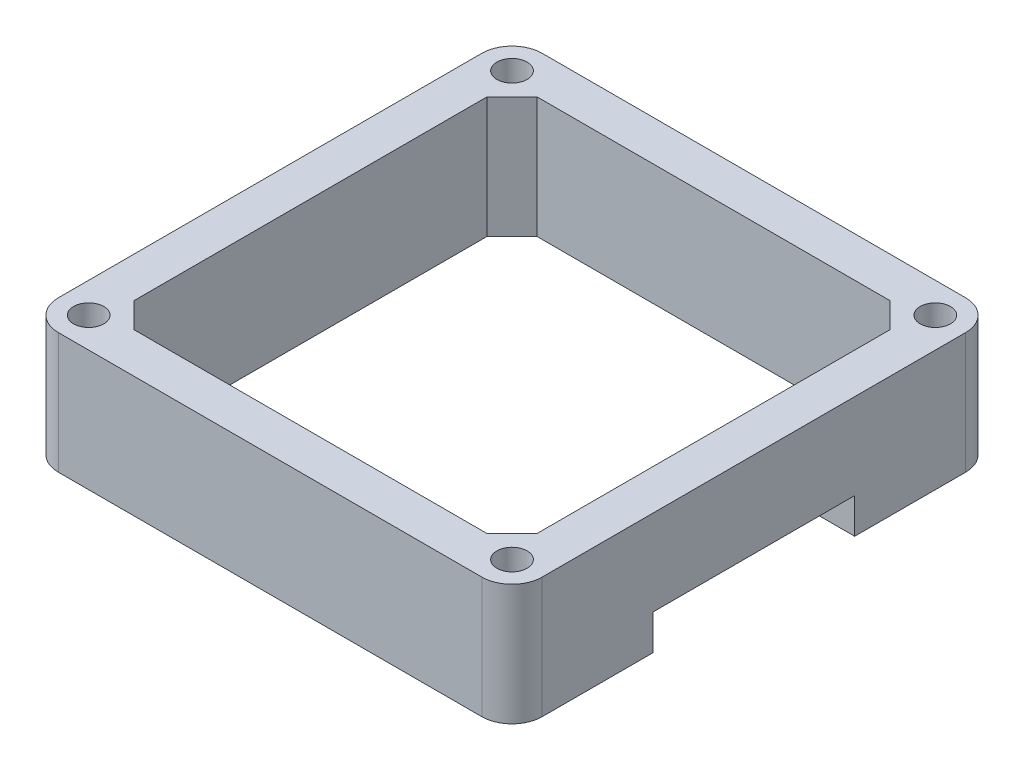
ISO-10303-21;
HEADER;
FILE_DESCRIPTION(('STEP AP214'),'2;1');
FILE_NAME('part.step','',(''),(''),'','','');
FILE_SCHEMA(('AUTOMOTIVE_DESIGN { 1 0 10303 214 1 1 1 1 }'));
ENDSEC;
DATA;
#1=APPLICATION_CONTEXT('core data for automotive mechanical design processes');
#2=APPLICATION_PROTOCOL_DEFINITION('international standard','automotive_design',2000,#1);
#3=PRODUCT_CONTEXT('',#1,'mechanical');
#4=PRODUCT('Part','Part','',(#3));
#5=PRODUCT_RELATED_PRODUCT_CATEGORY('part','',(#4));
#6=PRODUCT_DEFINITION_FORMATION('','',#4);
#7=PRODUCT_DEFINITION_CONTEXT('part definition',#1,'design');
#8=PRODUCT_DEFINITION('design','',#6,#7);
#9=PRODUCT_DEFINITION_SHAPE('','',#8);
#10=(LENGTH_UNIT() NAMED_UNIT(*) SI_UNIT(.MILLI.,.METRE.));
#11=(NAMED_UNIT(*) PLANE_ANGLE_UNIT() SI_UNIT($,.RADIAN.));
#12=(NAMED_UNIT(*) SI_UNIT($,.STERADIAN.) SOLID_ANGLE_UNIT());
#13=UNCERTAINTY_MEASURE_WITH_UNIT(LENGTH_MEASURE(1.E-05),#10,'distance_accuracy_value','');
#14=(GEOMETRIC_REPRESENTATION_CONTEXT(3) GLOBAL_UNCERTAINTY_ASSIGNED_CONTEXT((#13)) GLOBAL_UNIT_ASSIGNED_CONTEXT((#10,
#11,#12)) REPRESENTATION_CONTEXT('',''));
#15=CARTESIAN_POINT('',(0.,0.,0.));
#16=DIRECTION('',(0.,0.,1.));
#17=DIRECTION('',(1.,0.,0.));
#18=AXIS2_PLACEMENT_3D('',#15,#16,#17);
#19=CARTESIAN_POINT('',(3.,12.,-3.));
#20=DIRECTION('',(0.,-1.,0.));
#21=DIRECTION('',(0.,0.,-1.));
#22=AXIS2_PLACEMENT_3D('',#19,#20,#21);
#23=PLANE('',#22);
#24=CARTESIAN_POINT('',(45.,12.,-45.));
#25=DIRECTION('',(0.,1.,0.));
#26=DIRECTION('',(0.,0.,-1.));
#27=AXIS2_PLACEMENT_3D('',#24,#25,#26);
#28=CIRCLE('',#27,1.5);
#29=CARTESIAN_POINT('',(45.,12.,-46.5));
#30=VERTEX_POINT('',#29);
#31=EDGE_CURVE('E253',#30,#30,#28,.T.);
#32=ORIENTED_EDGE('',*,*,#31,.F.);
#33=EDGE_LOOP('',(#32));
#34=FACE_BOUND('',#33,.T.);
#35=CARTESIAN_POINT('',(45.,12.,-3.));
#36=DIRECTION('',(0.,1.,0.));
#37=DIRECTION('',(0.,0.,1.));
#38=AXIS2_PLACEMENT_3D('',#35,#36,#37);
#39=CIRCLE('',#38,1.5);
#40=CARTESIAN_POINT('',(45.,12.,-1.5));
#41=VERTEX_POINT('',#40);
#42=EDGE_CURVE('E261',#41,#41,#39,.T.);
#43=ORIENTED_EDGE('',*,*,#42,.F.);
#44=EDGE_LOOP('',(#43));
#45=FACE_BOUND('',#44,.T.);
#46=CARTESIAN_POINT('',(3.,12.,-3.));
#47=DIRECTION('',(0.,1.,0.));
#48=DIRECTION('',(0.,0.,-1.));
#49=AXIS2_PLACEMENT_3D('',#46,#47,#48);
#50=CIRCLE('',#49,1.5);
#51=CARTESIAN_POINT('',(3.,12.,-4.5));
#52=VERTEX_POINT('',#51);
#53=EDGE_CURVE('E269',#52,#52,#50,.T.);
#54=ORIENTED_EDGE('',*,*,#53,.F.);
#55=EDGE_LOOP('',(#54));
#56=FACE_BOUND('',#55,.T.);
#57=CARTESIAN_POINT('',(3.,12.,-45.));
#58=DIRECTION('',(0.,1.,0.));
#59=DIRECTION('',(0.,0.,1.));
#60=AXIS2_PLACEMENT_3D('',#57,#58,#59);
#61=CIRCLE('',#60,1.5);
#62=CARTESIAN_POINT('',(3.,12.,-43.5));
#63=VERTEX_POINT('',#62);
#64=EDGE_CURVE('E277',#63,#63,#61,.T.);
#65=ORIENTED_EDGE('',*,*,#64,.F.);
#66=EDGE_LOOP('',(#65));
#67=FACE_BOUND('',#66,.T.);
#68=CARTESIAN_POINT('',(3.,12.,-3.));
#69=DIRECTION('',(0.,1.,0.));
#70=DIRECTION('',(0.,0.,-1.));
#71=AXIS2_PLACEMENT_3D('',#68,#69,#70);
#72=CIRCLE('',#71,3.);
#73=CARTESIAN_POINT('',(0.,12.,-3.00000000000002));
#74=VERTEX_POINT('',#73);
#75=CARTESIAN_POINT('',(3.00000000000002,12.,0.));
#76=VERTEX_POINT('',#75);
#77=EDGE_CURVE('E285',#74,#76,#72,.T.);
#78=ORIENTED_EDGE('',*,*,#77,.T.);
#79=DIRECTION('',(1.,0.,0.));
#80=VECTOR('',#79,1.);
#81=CARTESIAN_POINT('',(3.00000000000002,12.,0.));
#82=LINE('',#81,#80);
#83=CARTESIAN_POINT('',(45.,12.,0.));
#84=VERTEX_POINT('',#83);
#85=EDGE_CURVE('E289',#76,#84,#82,.T.);
#86=ORIENTED_EDGE('',*,*,#85,.T.);
#87=CARTESIAN_POINT('',(45.,12.,-3.));
#88=DIRECTION('',(0.,1.,0.));
#89=DIRECTION('',(0.,0.,1.));
#90=AXIS2_PLACEMENT_3D('',#87,#88,#89);
#91=CIRCLE('',#90,3.);
#92=CARTESIAN_POINT('',(48.,12.,-3.00000000000002));
#93=VERTEX_POINT('',#92);
#94=EDGE_CURVE('E293',#84,#93,#91,.T.);
#95=ORIENTED_EDGE('',*,*,#94,.T.);
#96=DIRECTION('',(0.,0.,-1.));
#97=VECTOR('',#96,1.);
#98=CARTESIAN_POINT('',(48.,12.,-3.00000000000002));
#99=LINE('',#98,#97);
#100=CARTESIAN_POINT('',(48.,12.,-45.));
#101=VERTEX_POINT('',#100);
#102=EDGE_CURVE('E296',#93,#101,#99,.T.);
#103=ORIENTED_EDGE('',*,*,#102,.T.);
#104=CARTESIAN_POINT('',(45.,12.,-45.));
#105=DIRECTION('',(0.,1.,0.));
#106=DIRECTION('',(0.,0.,-1.));
#107=AXIS2_PLACEMENT_3D('',#104,#105,#106);
#108=CIRCLE('',#107,3.);
#109=CARTESIAN_POINT('',(45.,12.,-48.));
#110=VERTEX_POINT('',#109);
#111=EDGE_CURVE('E299',#101,#110,#108,.T.);
#112=ORIENTED_EDGE('',*,*,#111,.T.);
#113=DIRECTION('',(-1.,0.,0.));
#114=VECTOR('',#113,1.);
#115=CARTESIAN_POINT('',(3.00000000000002,12.,-48.));
#116=LINE('',#115,#114);
#117=CARTESIAN_POINT('',(3.00000000000002,12.,-48.));
#118=VERTEX_POINT('',#117);
#119=EDGE_CURVE('E302',#110,#118,#116,.T.);
#120=ORIENTED_EDGE('',*,*,#119,.T.);
#121=CARTESIAN_POINT('',(3.,12.,-45.));
#122=DIRECTION('',(0.,1.,0.));
#123=DIRECTION('',(0.,0.,-1.));
#124=AXIS2_PLACEMENT_3D('',#121,#122,#123);
#125=CIRCLE('',#124,3.);
#126=CARTESIAN_POINT('',(0.,12.,-45.));
#127=VERTEX_POINT('',#126);
#128=EDGE_CURVE('E305',#118,#127,#125,.T.);
#129=ORIENTED_EDGE('',*,*,#128,.T.);
#130=DIRECTION('',(0.,0.,1.));
#131=VECTOR('',#130,1.);
#132=CARTESIAN_POINT('',(0.,12.,-3.00000000000002));
#133=LINE('',#132,#131);
#134=EDGE_CURVE('E308',#127,#74,#133,.T.);
#135=ORIENTED_EDGE('',*,*,#134,.T.);
#136=EDGE_LOOP('',(#78,#86,#95,#103,#112,#120,#129,#135));
#137=FACE_BOUND('',#136,.T.);
#138=DIRECTION('',(-1.,0.,0.));
#139=VECTOR('',#138,1.);
#140=CARTESIAN_POINT('',(6.5,12.,-44.));
#141=LINE('',#140,#139);
#142=CARTESIAN_POINT('',(41.5,12.,-44.));
#143=VERTEX_POINT('',#142);
#144=CARTESIAN_POINT('',(6.5,12.,-44.));
#145=VERTEX_POINT('',#144);
#146=EDGE_CURVE('E225',#143,#145,#141,.T.);
#147=ORIENTED_EDGE('',*,*,#146,.F.);
#148=DIRECTION('',(-0.707106781186547,0.,-0.707106781186547));
#149=VECTOR('',#148,1.);
#150=CARTESIAN_POINT('',(41.5,12.,-44.));
#151=LINE('',#150,#149);
#152=CARTESIAN_POINT('',(44.,12.,-41.5));
#153=VERTEX_POINT('',#152);
#154=EDGE_CURVE('E230',#153,#143,#151,.T.);
#155=ORIENTED_EDGE('',*,*,#154,.F.);
#156=DIRECTION('',(0.,0.,-1.));
#157=VECTOR('',#156,1.);
#158=CARTESIAN_POINT('',(44.,12.,-41.5));
#159=LINE('',#158,#157);
#160=CARTESIAN_POINT('',(44.,12.,-6.5));
#161=VERTEX_POINT('',#160);
#162=EDGE_CURVE('E667',#161,#153,#159,.T.);
#163=ORIENTED_EDGE('',*,*,#162,.F.);
#164=DIRECTION('',(0.707106781186548,0.,-0.707106781186547));
#165=VECTOR('',#164,1.);
#166=CARTESIAN_POINT('',(41.5,12.,-4.));
#167=LINE('',#166,#165);
#168=CARTESIAN_POINT('',(41.5,12.,-4.));
#169=VERTEX_POINT('',#168);
#170=EDGE_CURVE('E664',#169,#161,#167,.T.);
#171=ORIENTED_EDGE('',*,*,#170,.F.);
#172=DIRECTION('',(1.,0.,0.));
#173=VECTOR('',#172,1.);
#174=CARTESIAN_POINT('',(6.5,12.,-4.));
#175=LINE('',#174,#173);
#176=CARTESIAN_POINT('',(6.5,12.,-4.));
#177=VERTEX_POINT('',#176);
#178=EDGE_CURVE('E661',#177,#169,#175,.T.);
#179=ORIENTED_EDGE('',*,*,#178,.F.);
#180=DIRECTION('',(0.707106781186547,0.,0.707106781186548));
#181=VECTOR('',#180,1.);
#182=CARTESIAN_POINT('',(4.,12.,-6.5));
#183=LINE('',#182,#181);
#184=CARTESIAN_POINT('',(4.,12.,-6.5));
#185=VERTEX_POINT('',#184);
#186=EDGE_CURVE('E658',#185,#177,#183,.T.);
#187=ORIENTED_EDGE('',*,*,#186,.F.);
#188=DIRECTION('',(0.,0.,1.));
#189=VECTOR('',#188,1.);
#190=CARTESIAN_POINT('',(4.,12.,-41.5));
#191=LINE('',#190,#189);
#192=CARTESIAN_POINT('',(4.,12.,-41.5));
#193=VERTEX_POINT('',#192);
#194=EDGE_CURVE('E655',#193,#185,#191,.T.);
#195=ORIENTED_EDGE('',*,*,#194,.F.);
#196=DIRECTION('',(-0.707106781186547,0.,0.707106781186548));
#197=VECTOR('',#196,1.);
#198=CARTESIAN_POINT('',(4.,12.,-41.5));
#199=LINE('',#198,#197);
#200=EDGE_CURVE('E652',#145,#193,#199,.T.);
#201=ORIENTED_EDGE('',*,*,#200,.F.);
#202=EDGE_LOOP('',(#147,#155,#163,#171,#179,#187,#195,#201));
#203=FACE_BOUND('',#202,.T.);
#204=ADVANCED_FACE('F47',(#34,#45,#56,#67,#137,#203),#23,.F.);
#205=CARTESIAN_POINT('',(3.,0.,-3.));
#206=DIRECTION('',(0.,-1.,0.));
#207=DIRECTION('',(0.,0.,-1.));
#208=AXIS2_PLACEMENT_3D('',#205,#206,#207);
#209=PLANE('',#208);
#210=DIRECTION('',(1.,0.,0.));
#211=VECTOR('',#210,1.);
#212=CARTESIAN_POINT('',(23.696059495753,0.,-34.));
#213=LINE('',#212,#211);
#214=CARTESIAN_POINT('',(44.,0.,-34.));
#215=VERTEX_POINT('',#214);
#216=CARTESIAN_POINT('',(48.,0.,-34.));
#217=VERTEX_POINT('',#216);
#218=EDGE_CURVE('E190',#215,#217,#213,.T.);
#219=ORIENTED_EDGE('',*,*,#218,.F.);
#220=DIRECTION('',(0.,0.,-1.));
#221=VECTOR('',#220,1.);
#222=CARTESIAN_POINT('',(44.,0.,-41.5));
#223=LINE('',#222,#221);
#224=CARTESIAN_POINT('',(44.,0.,-41.5));
#225=VERTEX_POINT('',#224);
#226=EDGE_CURVE('E203',#215,#225,#223,.T.);
#227=ORIENTED_EDGE('',*,*,#226,.T.);
#228=DIRECTION('',(-0.707106781186547,0.,-0.707106781186547));
#229=VECTOR('',#228,1.);
#230=CARTESIAN_POINT('',(41.5,0.,-44.));
#231=LINE('',#230,#229);
#232=CARTESIAN_POINT('',(41.5,0.,-44.));
#233=VERTEX_POINT('',#232);
#234=EDGE_CURVE('E217',#225,#233,#231,.T.);
#235=ORIENTED_EDGE('',*,*,#234,.T.);
#236=DIRECTION('',(-1.,0.,0.));
#237=VECTOR('',#236,1.);
#238=CARTESIAN_POINT('',(6.5,0.,-44.));
#239=LINE('',#238,#237);
#240=CARTESIAN_POINT('',(6.5,0.,-44.));
#241=VERTEX_POINT('',#240);
#242=EDGE_CURVE('E649',#233,#241,#239,.T.);
#243=ORIENTED_EDGE('',*,*,#242,.T.);
#244=DIRECTION('',(-0.707106781186547,0.,0.707106781186548));
#245=VECTOR('',#244,1.);
#246=CARTESIAN_POINT('',(4.,0.,-41.5));
#247=LINE('',#246,#245);
#248=CARTESIAN_POINT('',(4.,0.,-41.5));
#249=VERTEX_POINT('',#248);
#250=EDGE_CURVE('E675',#241,#249,#247,.T.);
#251=ORIENTED_EDGE('',*,*,#250,.T.);
#252=DIRECTION('',(0.,0.,1.));
#253=VECTOR('',#252,1.);
#254=CARTESIAN_POINT('',(4.,0.,-41.5));
#255=LINE('',#254,#253);
#256=CARTESIAN_POINT('',(4.,0.,-6.5));
#257=VERTEX_POINT('',#256);
#258=EDGE_CURVE('E679',#249,#257,#255,.T.);
#259=ORIENTED_EDGE('',*,*,#258,.T.);
#260=DIRECTION('',(0.707106781186547,0.,0.707106781186548));
#261=VECTOR('',#260,1.);
#262=CARTESIAN_POINT('',(4.,0.,-6.5));
#263=LINE('',#262,#261);
#264=CARTESIAN_POINT('',(6.5,0.,-4.));
#265=VERTEX_POINT('',#264);
#266=EDGE_CURVE('E683',#257,#265,#263,.T.);
#267=ORIENTED_EDGE('',*,*,#266,.T.);
#268=DIRECTION('',(1.,0.,0.));
#269=VECTOR('',#268,1.);
#270=CARTESIAN_POINT('',(6.5,0.,-4.));
#271=LINE('',#270,#269);
#272=CARTESIAN_POINT('',(41.5,0.,-4.));
#273=VERTEX_POINT('',#272);
#274=EDGE_CURVE('E219',#265,#273,#271,.T.);
#275=ORIENTED_EDGE('',*,*,#274,.T.);
#276=DIRECTION('',(0.707106781186548,0.,-0.707106781186547));
#277=VECTOR('',#276,1.);
#278=CARTESIAN_POINT('',(41.5,0.,-4.));
#279=LINE('',#278,#277);
#280=CARTESIAN_POINT('',(44.,0.,-6.5));
#281=VERTEX_POINT('',#280);
#282=EDGE_CURVE('E212',#273,#281,#279,.T.);
#283=ORIENTED_EDGE('',*,*,#282,.T.);
#284=CARTESIAN_POINT('',(44.,0.,-14.));
#285=VERTEX_POINT('',#284);
#286=EDGE_CURVE('E211',#281,#285,#223,.T.);
#287=ORIENTED_EDGE('',*,*,#286,.T.);
#288=DIRECTION('',(1.,0.,0.));
#289=VECTOR('',#288,1.);
#290=CARTESIAN_POINT('',(23.696059495753,0.,-14.));
#291=LINE('',#290,#289);
#292=CARTESIAN_POINT('',(48.,0.,-14.));
#293=VERTEX_POINT('',#292);
#294=EDGE_CURVE('E63',#285,#293,#291,.T.);
#295=ORIENTED_EDGE('',*,*,#294,.T.);
#296=DIRECTION('',(0.,0.,-1.));
#297=VECTOR('',#296,1.);
#298=CARTESIAN_POINT('',(48.,0.,-3.00000000000002));
#299=LINE('',#298,#297);
#300=CARTESIAN_POINT('',(48.,0.,-3.00000000000002));
#301=VERTEX_POINT('',#300);
#302=EDGE_CURVE('E321',#301,#293,#299,.T.);
#303=ORIENTED_EDGE('',*,*,#302,.F.);
#304=CARTESIAN_POINT('',(45.,0.,-3.));
#305=DIRECTION('',(0.,1.,0.));
#306=DIRECTION('',(0.,0.,1.));
#307=AXIS2_PLACEMENT_3D('',#304,#305,#306);
#308=CIRCLE('',#307,3.);
#309=CARTESIAN_POINT('',(45.,0.,0.));
#310=VERTEX_POINT('',#309);
#311=EDGE_CURVE('E318',#310,#301,#308,.T.);
#312=ORIENTED_EDGE('',*,*,#311,.F.);
#313=DIRECTION('',(1.,0.,0.));
#314=VECTOR('',#313,1.);
#315=CARTESIAN_POINT('',(3.00000000000002,0.,0.));
#316=LINE('',#315,#314);
#317=CARTESIAN_POINT('',(3.00000000000002,0.,0.));
#318=VERTEX_POINT('',#317);
#319=EDGE_CURVE('E315',#318,#310,#316,.T.);
#320=ORIENTED_EDGE('',*,*,#319,.F.);
#321=CARTESIAN_POINT('',(3.,0.,-3.));
#322=DIRECTION('',(0.,1.,0.));
#323=DIRECTION('',(0.,0.,-1.));
#324=AXIS2_PLACEMENT_3D('',#321,#322,#323);
#325=CIRCLE('',#324,3.);
#326=CARTESIAN_POINT('',(0.,0.,-3.00000000000002));
#327=VERTEX_POINT('',#326);
#328=EDGE_CURVE('E281',#327,#318,#325,.T.);
#329=ORIENTED_EDGE('',*,*,#328,.F.);
#330=DIRECTION('',(0.,0.,1.));
#331=VECTOR('',#330,1.);
#332=CARTESIAN_POINT('',(0.,0.,-3.00000000000002));
#333=LINE('',#332,#331);
#334=CARTESIAN_POINT('',(0.,0.,-45.));
#335=VERTEX_POINT('',#334);
#336=EDGE_CURVE('E290',#335,#327,#333,.T.);
#337=ORIENTED_EDGE('',*,*,#336,.F.);
#338=CARTESIAN_POINT('',(3.,0.,-45.));
#339=DIRECTION('',(0.,1.,0.));
#340=DIRECTION('',(0.,0.,-1.));
#341=AXIS2_PLACEMENT_3D('',#338,#339,#340);
#342=CIRCLE('',#341,3.);
#343=CARTESIAN_POINT('',(3.00000000000002,0.,-48.));
#344=VERTEX_POINT('',#343);
#345=EDGE_CURVE('E331',#344,#335,#342,.T.);
#346=ORIENTED_EDGE('',*,*,#345,.F.);
#347=DIRECTION('',(-1.,0.,0.));
#348=VECTOR('',#347,1.);
#349=CARTESIAN_POINT('',(3.00000000000002,0.,-48.));
#350=LINE('',#349,#348);
#351=CARTESIAN_POINT('',(45.,0.,-48.));
#352=VERTEX_POINT('',#351);
#353=EDGE_CURVE('E328',#352,#344,#350,.T.);
#354=ORIENTED_EDGE('',*,*,#353,.F.);
#355=CARTESIAN_POINT('',(45.,0.,-45.));
#356=DIRECTION('',(0.,1.,0.));
#357=DIRECTION('',(0.,0.,-1.));
#358=AXIS2_PLACEMENT_3D('',#355,#356,#357);
#359=CIRCLE('',#358,3.);
#360=CARTESIAN_POINT('',(48.,0.,-45.));
#361=VERTEX_POINT('',#360);
#362=EDGE_CURVE('E325',#361,#352,#359,.T.);
#363=ORIENTED_EDGE('',*,*,#362,.F.);
#364=EDGE_CURVE('E205',#217,#361,#299,.T.);
#365=ORIENTED_EDGE('',*,*,#364,.F.);
#366=EDGE_LOOP('',(#219,#227,#235,#243,#251,#259,#267,#275,#283,#287,#295,#303,#312,#320,#329,
#337,#346,#354,#363,#365));
#367=FACE_BOUND('',#366,.T.);
#368=CARTESIAN_POINT('',(45.,0.,-3.));
#369=DIRECTION('',(0.,1.,0.));
#370=DIRECTION('',(0.,0.,1.));
#371=AXIS2_PLACEMENT_3D('',#368,#369,#370);
#372=CIRCLE('',#371,1.5);
#373=CARTESIAN_POINT('',(45.,0.,-1.5));
#374=VERTEX_POINT('',#373);
#375=EDGE_CURVE('E257',#374,#374,#372,.T.);
#376=ORIENTED_EDGE('',*,*,#375,.T.);
#377=EDGE_LOOP('',(#376));
#378=FACE_BOUND('',#377,.T.);
#379=CARTESIAN_POINT('',(3.,0.,-45.));
#380=DIRECTION('',(0.,1.,0.));
#381=DIRECTION('',(0.,0.,1.));
#382=AXIS2_PLACEMENT_3D('',#379,#380,#381);
#383=CIRCLE('',#382,1.5);
#384=CARTESIAN_POINT('',(3.,0.,-43.5));
#385=VERTEX_POINT('',#384);
#386=EDGE_CURVE('E273',#385,#385,#383,.T.);
#387=ORIENTED_EDGE('',*,*,#386,.T.);
#388=EDGE_LOOP('',(#387));
#389=FACE_BOUND('',#388,.T.);
#390=CARTESIAN_POINT('',(3.,0.,-3.));
#391=DIRECTION('',(0.,1.,0.));
#392=DIRECTION('',(0.,0.,-1.));
#393=AXIS2_PLACEMENT_3D('',#390,#391,#392);
#394=CIRCLE('',#393,1.5);
#395=CARTESIAN_POINT('',(3.,0.,-4.5));
#396=VERTEX_POINT('',#395);
#397=EDGE_CURVE('E265',#396,#396,#394,.T.);
#398=ORIENTED_EDGE('',*,*,#397,.T.);
#399=EDGE_LOOP('',(#398));
#400=FACE_BOUND('',#399,.T.);
#401=CARTESIAN_POINT('',(45.,0.,-45.));
#402=DIRECTION('',(0.,1.,0.));
#403=DIRECTION('',(0.,0.,-1.));
#404=AXIS2_PLACEMENT_3D('',#401,#402,#403);
#405=CIRCLE('',#404,1.5);
#406=CARTESIAN_POINT('',(45.,0.,-46.5));
#407=VERTEX_POINT('',#406);
#408=EDGE_CURVE('E252',#407,#407,#405,.T.);
#409=ORIENTED_EDGE('',*,*,#408,.T.);
#410=EDGE_LOOP('',(#409));
#411=FACE_BOUND('',#410,.T.);
#412=ADVANCED_FACE('F200',(#367,#378,#389,#400,#411),#209,.T.);
#413=CARTESIAN_POINT('',(3.,12.,-3.));
#414=DIRECTION('',(0.,-1.,0.));
#415=DIRECTION('',(0.,0.,-1.));
#416=AXIS2_PLACEMENT_3D('',#413,#414,#415);
#417=CYLINDRICAL_SURFACE('',#416,3.);
#418=ORIENTED_EDGE('',*,*,#328,.T.);
#419=DIRECTION('',(0.,-1.,0.));
#420=VECTOR('',#419,1.);
#421=CARTESIAN_POINT('',(3.00000000000002,12.,0.));
#422=LINE('',#421,#420);
#423=EDGE_CURVE('E11',#76,#318,#422,.T.);
#424=ORIENTED_EDGE('',*,*,#423,.F.);
#425=ORIENTED_EDGE('',*,*,#77,.F.);
#426=DIRECTION('',(0.,-1.,0.));
#427=VECTOR('',#426,1.);
#428=CARTESIAN_POINT('',(0.,12.,-3.00000000000002));
#429=LINE('',#428,#427);
#430=EDGE_CURVE('E311',#74,#327,#429,.T.);
#431=ORIENTED_EDGE('',*,*,#430,.T.);
#432=EDGE_LOOP('',(#418,#424,#425,#431));
#433=FACE_BOUND('',#432,.T.);
#434=ADVANCED_FACE('F49',(#433),#417,.T.);
#435=CARTESIAN_POINT('',(3.00000000000002,12.,0.));
#436=DIRECTION('',(0.,0.,-1.));
#437=DIRECTION('',(-1.,0.,0.));
#438=AXIS2_PLACEMENT_3D('',#435,#436,#437);
#439=PLANE('',#438);
#440=ORIENTED_EDGE('',*,*,#319,.T.);
#441=DIRECTION('',(0.,-1.,0.));
#442=VECTOR('',#441,1.);
#443=CARTESIAN_POINT('',(45.,12.,0.));
#444=LINE('',#443,#442);
#445=EDGE_CURVE('E56',#84,#310,#444,.T.);
#446=ORIENTED_EDGE('',*,*,#445,.F.);
#447=ORIENTED_EDGE('',*,*,#85,.F.);
#448=ORIENTED_EDGE('',*,*,#423,.T.);
#449=EDGE_LOOP('',(#440,#446,#447,#448));
#450=FACE_BOUND('',#449,.T.);
#451=ADVANCED_FACE('F382',(#450),#439,.F.);
#452=CARTESIAN_POINT('',(45.,12.,-3.));
#453=DIRECTION('',(0.,-1.,0.));
#454=DIRECTION('',(0.,0.,-1.));
#455=AXIS2_PLACEMENT_3D('',#452,#453,#454);
#456=CYLINDRICAL_SURFACE('',#455,3.);
#457=ORIENTED_EDGE('',*,*,#311,.T.);
#458=DIRECTION('',(0.,-1.,0.));
#459=VECTOR('',#458,1.);
#460=CARTESIAN_POINT('',(48.,12.,-3.00000000000002));
#461=LINE('',#460,#459);
#462=EDGE_CURVE('E355',#93,#301,#461,.T.);
#463=ORIENTED_EDGE('',*,*,#462,.F.);
#464=ORIENTED_EDGE('',*,*,#94,.F.);
#465=ORIENTED_EDGE('',*,*,#445,.T.);
#466=EDGE_LOOP('',(#457,#463,#464,#465));
#467=FACE_BOUND('',#466,.T.);
#468=ADVANCED_FACE('F364',(#467),#456,.T.);
#469=CARTESIAN_POINT('',(48.,12.,-3.00000000000002));
#470=DIRECTION('',(-1.,0.,0.));
#471=DIRECTION('',(0.,0.,1.));
#472=AXIS2_PLACEMENT_3D('',#469,#470,#471);
#473=PLANE('',#472);
#474=DIRECTION('',(0.,0.,1.));
#475=VECTOR('',#474,1.);
#476=CARTESIAN_POINT('',(48.,3.5,-14.));
#477=LINE('',#476,#475);
#478=CARTESIAN_POINT('',(48.,3.5,-34.));
#479=VERTEX_POINT('',#478);
#480=CARTESIAN_POINT('',(48.,3.5,-14.));
#481=VERTEX_POINT('',#480);
#482=EDGE_CURVE('E207',#479,#481,#477,.T.);
#483=ORIENTED_EDGE('',*,*,#482,.F.);
#484=DIRECTION('',(0.,1.,0.));
#485=VECTOR('',#484,1.);
#486=CARTESIAN_POINT('',(48.,0.,-34.));
#487=LINE('',#486,#485);
#488=EDGE_CURVE('E634',#217,#479,#487,.T.);
#489=ORIENTED_EDGE('',*,*,#488,.F.);
#490=ORIENTED_EDGE('',*,*,#364,.T.);
#491=DIRECTION('',(0.,-1.,0.));
#492=VECTOR('',#491,1.);
#493=CARTESIAN_POINT('',(48.,12.,-45.));
#494=LINE('',#493,#492);
#495=EDGE_CURVE('E351',#101,#361,#494,.T.);
#496=ORIENTED_EDGE('',*,*,#495,.F.);
#497=ORIENTED_EDGE('',*,*,#102,.F.);
#498=ORIENTED_EDGE('',*,*,#462,.T.);
#499=ORIENTED_EDGE('',*,*,#302,.T.);
#500=DIRECTION('',(0.,-1.,0.));
#501=VECTOR('',#500,1.);
#502=CARTESIAN_POINT('',(48.,0.,-14.));
#503=LINE('',#502,#501);
#504=EDGE_CURVE('E373',#481,#293,#503,.T.);
#505=ORIENTED_EDGE('',*,*,#504,.F.);
#506=EDGE_LOOP('',(#483,#489,#490,#496,#497,#498,#499,#505));
#507=FACE_BOUND('',#506,.T.);
#508=ADVANCED_FACE('F372',(#507),#473,.F.);
#509=CARTESIAN_POINT('',(45.,12.,-45.));
#510=DIRECTION('',(0.,-1.,0.));
#511=DIRECTION('',(0.,0.,-1.));
#512=AXIS2_PLACEMENT_3D('',#509,#510,#511);
#513=CYLINDRICAL_SURFACE('',#512,3.);
#514=ORIENTED_EDGE('',*,*,#362,.T.);
#515=DIRECTION('',(0.,-1.,0.));
#516=VECTOR('',#515,1.);
#517=CARTESIAN_POINT('',(45.,12.,-48.));
#518=LINE('',#517,#516);
#519=EDGE_CURVE('E347',#110,#352,#518,.T.);
#520=ORIENTED_EDGE('',*,*,#519,.F.);
#521=ORIENTED_EDGE('',*,*,#111,.F.);
#522=ORIENTED_EDGE('',*,*,#495,.T.);
#523=EDGE_LOOP('',(#514,#520,#521,#522));
#524=FACE_BOUND('',#523,.T.);
#525=ADVANCED_FACE('F400',(#524),#513,.T.);
#526=CARTESIAN_POINT('',(3.00000000000002,12.,-48.));
#527=DIRECTION('',(0.,0.,1.));
#528=DIRECTION('',(1.,0.,0.));
#529=AXIS2_PLACEMENT_3D('',#526,#527,#528);
#530=PLANE('',#529);
#531=ORIENTED_EDGE('',*,*,#353,.T.);
#532=DIRECTION('',(0.,-1.,0.));
#533=VECTOR('',#532,1.);
#534=CARTESIAN_POINT('',(3.00000000000002,12.,-48.));
#535=LINE('',#534,#533);
#536=EDGE_CURVE('E343',#118,#344,#535,.T.);
#537=ORIENTED_EDGE('',*,*,#536,.F.);
#538=ORIENTED_EDGE('',*,*,#119,.F.);
#539=ORIENTED_EDGE('',*,*,#519,.T.);
#540=EDGE_LOOP('',(#531,#537,#538,#539));
#541=FACE_BOUND('',#540,.T.);
#542=ADVANCED_FACE('F398',(#541),#530,.F.);
#543=CARTESIAN_POINT('',(3.,12.,-45.));
#544=DIRECTION('',(0.,-1.,0.));
#545=DIRECTION('',(0.,0.,-1.));
#546=AXIS2_PLACEMENT_3D('',#543,#544,#545);
#547=CYLINDRICAL_SURFACE('',#546,3.);
#548=ORIENTED_EDGE('',*,*,#345,.T.);
#549=DIRECTION('',(0.,-1.,0.));
#550=VECTOR('',#549,1.);
#551=CARTESIAN_POINT('',(0.,12.,-45.));
#552=LINE('',#551,#550);
#553=EDGE_CURVE('E339',#127,#335,#552,.T.);
#554=ORIENTED_EDGE('',*,*,#553,.F.);
#555=ORIENTED_EDGE('',*,*,#128,.F.);
#556=ORIENTED_EDGE('',*,*,#536,.T.);
#557=EDGE_LOOP('',(#548,#554,#555,#556));
#558=FACE_BOUND('',#557,.T.);
#559=ADVANCED_FACE('F394',(#558),#547,.T.);
#560=CARTESIAN_POINT('',(0.,12.,-3.00000000000002));
#561=DIRECTION('',(1.,0.,0.));
#562=DIRECTION('',(0.,0.,-1.));
#563=AXIS2_PLACEMENT_3D('',#560,#561,#562);
#564=PLANE('',#563);
#565=ORIENTED_EDGE('',*,*,#336,.T.);
#566=ORIENTED_EDGE('',*,*,#430,.F.);
#567=ORIENTED_EDGE('',*,*,#134,.F.);
#568=ORIENTED_EDGE('',*,*,#553,.T.);
#569=EDGE_LOOP('',(#565,#566,#567,#568));
#570=FACE_BOUND('',#569,.T.);
#571=ADVANCED_FACE('F389',(#570),#564,.F.);
#572=CARTESIAN_POINT('',(3.,12.,-45.));
#573=DIRECTION('',(0.,-1.,0.));
#574=DIRECTION('',(0.,0.,-1.));
#575=AXIS2_PLACEMENT_3D('',#572,#573,#574);
#576=CYLINDRICAL_SURFACE('',#575,1.5);
#577=ORIENTED_EDGE('',*,*,#64,.T.);
#578=EDGE_LOOP('',(#577));
#579=FACE_BOUND('',#578,.T.);
#580=ORIENTED_EDGE('',*,*,#386,.F.);
#581=EDGE_LOOP('',(#580));
#582=FACE_BOUND('',#581,.T.);
#583=ADVANCED_FACE('F421',(#579,#582),#576,.F.);
#584=CARTESIAN_POINT('',(3.,12.,-3.));
#585=DIRECTION('',(0.,-1.,0.));
#586=DIRECTION('',(0.,0.,-1.));
#587=AXIS2_PLACEMENT_3D('',#584,#585,#586);
#588=CYLINDRICAL_SURFACE('',#587,1.5);
#589=ORIENTED_EDGE('',*,*,#53,.T.);
#590=EDGE_LOOP('',(#589));
#591=FACE_BOUND('',#590,.T.);
#592=ORIENTED_EDGE('',*,*,#397,.F.);
#593=EDGE_LOOP('',(#592));
#594=FACE_BOUND('',#593,.T.);
#595=ADVANCED_FACE('F443',(#591,#594),#588,.F.);
#596=CARTESIAN_POINT('',(45.,12.,-3.));
#597=DIRECTION('',(0.,-1.,0.));
#598=DIRECTION('',(0.,0.,-1.));
#599=AXIS2_PLACEMENT_3D('',#596,#597,#598);
#600=CYLINDRICAL_SURFACE('',#599,1.5);
#601=ORIENTED_EDGE('',*,*,#42,.T.);
#602=EDGE_LOOP('',(#601));
#603=FACE_BOUND('',#602,.T.);
#604=ORIENTED_EDGE('',*,*,#375,.F.);
#605=EDGE_LOOP('',(#604));
#606=FACE_BOUND('',#605,.T.);
#607=ADVANCED_FACE('F451',(#603,#606),#600,.F.);
#608=CARTESIAN_POINT('',(45.,12.,-45.));
#609=DIRECTION('',(0.,-1.,0.));
#610=DIRECTION('',(0.,0.,-1.));
#611=AXIS2_PLACEMENT_3D('',#608,#609,#610);
#612=CYLINDRICAL_SURFACE('',#611,1.5);
#613=ORIENTED_EDGE('',*,*,#31,.T.);
#614=EDGE_LOOP('',(#613));
#615=FACE_BOUND('',#614,.T.);
#616=ORIENTED_EDGE('',*,*,#408,.F.);
#617=EDGE_LOOP('',(#616));
#618=FACE_BOUND('',#617,.T.);
#619=ADVANCED_FACE('F459',(#615,#618),#612,.F.);
#620=CARTESIAN_POINT('',(6.5,12.,-44.));
#621=DIRECTION('',(0.,0.,1.));
#622=DIRECTION('',(1.,0.,0.));
#623=AXIS2_PLACEMENT_3D('',#620,#621,#622);
#624=PLANE('',#623);
#625=ORIENTED_EDGE('',*,*,#242,.F.);
#626=DIRECTION('',(0.,-1.,0.));
#627=VECTOR('',#626,1.);
#628=CARTESIAN_POINT('',(41.5,12.,-44.));
#629=LINE('',#628,#627);
#630=EDGE_CURVE('E226',#143,#233,#629,.T.);
#631=ORIENTED_EDGE('',*,*,#630,.F.);
#632=ORIENTED_EDGE('',*,*,#146,.T.);
#633=DIRECTION('',(0.,-1.,0.));
#634=VECTOR('',#633,1.);
#635=CARTESIAN_POINT('',(6.5,12.,-44.));
#636=LINE('',#635,#634);
#637=EDGE_CURVE('E248',#145,#241,#636,.T.);
#638=ORIENTED_EDGE('',*,*,#637,.T.);
#639=EDGE_LOOP('',(#625,#631,#632,#638));
#640=FACE_BOUND('',#639,.T.);
#641=ADVANCED_FACE('F468',(#640),#624,.T.);
#642=CARTESIAN_POINT('',(4.,12.,-41.5));
#643=DIRECTION('',(0.707106781186548,0.,0.707106781186547));
#644=DIRECTION('',(0.707106781186547,0.,-0.707106781186548));
#645=AXIS2_PLACEMENT_3D('',#642,#643,#644);
#646=PLANE('',#645);
#647=ORIENTED_EDGE('',*,*,#250,.F.);
#648=ORIENTED_EDGE('',*,*,#637,.F.);
#649=ORIENTED_EDGE('',*,*,#200,.T.);
#650=DIRECTION('',(0.,-1.,0.));
#651=VECTOR('',#650,1.);
#652=CARTESIAN_POINT('',(4.,12.,-41.5));
#653=LINE('',#652,#651);
#654=EDGE_CURVE('E245',#193,#249,#653,.T.);
#655=ORIENTED_EDGE('',*,*,#654,.T.);
#656=EDGE_LOOP('',(#647,#648,#649,#655));
#657=FACE_BOUND('',#656,.T.);
#658=ADVANCED_FACE('F477',(#657),#646,.T.);
#659=CARTESIAN_POINT('',(4.,12.,-41.5));
#660=DIRECTION('',(1.,0.,0.));
#661=DIRECTION('',(0.,0.,-1.));
#662=AXIS2_PLACEMENT_3D('',#659,#660,#661);
#663=PLANE('',#662);
#664=ORIENTED_EDGE('',*,*,#258,.F.);
#665=ORIENTED_EDGE('',*,*,#654,.F.);
#666=ORIENTED_EDGE('',*,*,#194,.T.);
#667=DIRECTION('',(0.,-1.,0.));
#668=VECTOR('',#667,1.);
#669=CARTESIAN_POINT('',(4.,12.,-6.5));
#670=LINE('',#669,#668);
#671=EDGE_CURVE('E242',#185,#257,#670,.T.);
#672=ORIENTED_EDGE('',*,*,#671,.T.);
#673=EDGE_LOOP('',(#664,#665,#666,#672));
#674=FACE_BOUND('',#673,.T.);
#675=ADVANCED_FACE('F486',(#674),#663,.T.);
#676=CARTESIAN_POINT('',(4.,12.,-6.5));
#677=DIRECTION('',(0.707106781186548,0.,-0.707106781186547));
#678=DIRECTION('',(-0.707106781186547,0.,-0.707106781186548));
#679=AXIS2_PLACEMENT_3D('',#676,#677,#678);
#680=PLANE('',#679);
#681=ORIENTED_EDGE('',*,*,#266,.F.);
#682=ORIENTED_EDGE('',*,*,#671,.F.);
#683=ORIENTED_EDGE('',*,*,#186,.T.);
#684=DIRECTION('',(0.,-1.,0.));
#685=VECTOR('',#684,1.);
#686=CARTESIAN_POINT('',(6.5,12.,-4.));
#687=LINE('',#686,#685);
#688=EDGE_CURVE('E239',#177,#265,#687,.T.);
#689=ORIENTED_EDGE('',*,*,#688,.T.);
#690=EDGE_LOOP('',(#681,#682,#683,#689));
#691=FACE_BOUND('',#690,.T.);
#692=ADVANCED_FACE('F495',(#691),#680,.T.);
#693=CARTESIAN_POINT('',(6.5,12.,-4.));
#694=DIRECTION('',(0.,0.,-1.));
#695=DIRECTION('',(-1.,0.,0.));
#696=AXIS2_PLACEMENT_3D('',#693,#694,#695);
#697=PLANE('',#696);
#698=ORIENTED_EDGE('',*,*,#274,.F.);
#699=ORIENTED_EDGE('',*,*,#688,.F.);
#700=ORIENTED_EDGE('',*,*,#178,.T.);
#701=DIRECTION('',(0.,-1.,0.));
#702=VECTOR('',#701,1.);
#703=CARTESIAN_POINT('',(41.5,12.,-4.));
#704=LINE('',#703,#702);
#705=EDGE_CURVE('E236',#169,#273,#704,.T.);
#706=ORIENTED_EDGE('',*,*,#705,.T.);
#707=EDGE_LOOP('',(#698,#699,#700,#706));
#708=FACE_BOUND('',#707,.T.);
#709=ADVANCED_FACE('F504',(#708),#697,.T.);
#710=CARTESIAN_POINT('',(41.5,12.,-4.));
#711=DIRECTION('',(-0.707106781186547,0.,-0.707106781186548));
#712=DIRECTION('',(-0.707106781186548,0.,0.707106781186547));
#713=AXIS2_PLACEMENT_3D('',#710,#711,#712);
#714=PLANE('',#713);
#715=ORIENTED_EDGE('',*,*,#282,.F.);
#716=ORIENTED_EDGE('',*,*,#705,.F.);
#717=ORIENTED_EDGE('',*,*,#170,.T.);
#718=DIRECTION('',(0.,-1.,0.));
#719=VECTOR('',#718,1.);
#720=CARTESIAN_POINT('',(44.,12.,-6.5));
#721=LINE('',#720,#719);
#722=EDGE_CURVE('E233',#161,#281,#721,.T.);
#723=ORIENTED_EDGE('',*,*,#722,.T.);
#724=EDGE_LOOP('',(#715,#716,#717,#723));
#725=FACE_BOUND('',#724,.T.);
#726=ADVANCED_FACE('F513',(#725),#714,.T.);
#727=CARTESIAN_POINT('',(44.,12.,-41.5));
#728=DIRECTION('',(-1.,0.,0.));
#729=DIRECTION('',(0.,0.,1.));
#730=AXIS2_PLACEMENT_3D('',#727,#728,#729);
#731=PLANE('',#730);
#732=DIRECTION('',(0.,1.,0.));
#733=VECTOR('',#732,1.);
#734=CARTESIAN_POINT('',(44.,0.,-34.));
#735=LINE('',#734,#733);
#736=CARTESIAN_POINT('',(44.,3.5,-34.));
#737=VERTEX_POINT('',#736);
#738=EDGE_CURVE('E186',#215,#737,#735,.T.);
#739=ORIENTED_EDGE('',*,*,#738,.T.);
#740=DIRECTION('',(0.,0.,1.));
#741=VECTOR('',#740,1.);
#742=CARTESIAN_POINT('',(44.,3.5,-14.));
#743=LINE('',#742,#741);
#744=CARTESIAN_POINT('',(44.,3.5,-14.));
#745=VERTEX_POINT('',#744);
#746=EDGE_CURVE('E631',#737,#745,#743,.T.);
#747=ORIENTED_EDGE('',*,*,#746,.T.);
#748=DIRECTION('',(0.,-1.,0.));
#749=VECTOR('',#748,1.);
#750=CARTESIAN_POINT('',(44.,0.,-14.));
#751=LINE('',#750,#749);
#752=EDGE_CURVE('E629',#745,#285,#751,.T.);
#753=ORIENTED_EDGE('',*,*,#752,.T.);
#754=ORIENTED_EDGE('',*,*,#286,.F.);
#755=ORIENTED_EDGE('',*,*,#722,.F.);
#756=ORIENTED_EDGE('',*,*,#162,.T.);
#757=DIRECTION('',(0.,-1.,0.));
#758=VECTOR('',#757,1.);
#759=CARTESIAN_POINT('',(44.,12.,-41.5));
#760=LINE('',#759,#758);
#761=EDGE_CURVE('E71',#153,#225,#760,.T.);
#762=ORIENTED_EDGE('',*,*,#761,.T.);
#763=ORIENTED_EDGE('',*,*,#226,.F.);
#764=EDGE_LOOP('',(#739,#747,#753,#754,#755,#756,#762,#763));
#765=FACE_BOUND('',#764,.T.);
#766=ADVANCED_FACE('F209',(#765),#731,.T.);
#767=CARTESIAN_POINT('',(41.5,12.,-44.));
#768=DIRECTION('',(-0.707106781186548,0.,0.707106781186548));
#769=DIRECTION('',(0.707106781186548,0.,0.707106781186548));
#770=AXIS2_PLACEMENT_3D('',#767,#768,#769);
#771=PLANE('',#770);
#772=ORIENTED_EDGE('',*,*,#234,.F.);
#773=ORIENTED_EDGE('',*,*,#761,.F.);
#774=ORIENTED_EDGE('',*,*,#154,.T.);
#775=ORIENTED_EDGE('',*,*,#630,.T.);
#776=EDGE_LOOP('',(#772,#773,#774,#775));
#777=FACE_BOUND('',#776,.T.);
#778=ADVANCED_FACE('F528',(#777),#771,.T.);
#779=CARTESIAN_POINT('',(23.696059495753,0.,-34.));
#780=DIRECTION('',(0.,0.,-1.));
#781=DIRECTION('',(-1.,0.,0.));
#782=AXIS2_PLACEMENT_3D('',#779,#780,#781);
#783=PLANE('',#782);
#784=ORIENTED_EDGE('',*,*,#218,.T.);
#785=ORIENTED_EDGE('',*,*,#488,.T.);
#786=DIRECTION('',(1.,0.,0.));
#787=VECTOR('',#786,1.);
#788=CARTESIAN_POINT('',(23.696059495753,3.5,-34.));
#789=LINE('',#788,#787);
#790=EDGE_CURVE('E192',#737,#479,#789,.T.);
#791=ORIENTED_EDGE('',*,*,#790,.F.);
#792=ORIENTED_EDGE('',*,*,#738,.F.);
#793=EDGE_LOOP('',(#784,#785,#791,#792));
#794=FACE_BOUND('',#793,.T.);
#795=ADVANCED_FACE('F188',(#794),#783,.F.);
#796=CARTESIAN_POINT('',(23.696059495753,3.5,-14.));
#797=DIRECTION('',(0.,1.,0.));
#798=DIRECTION('',(0.,0.,1.));
#799=AXIS2_PLACEMENT_3D('',#796,#797,#798);
#800=PLANE('',#799);
#801=ORIENTED_EDGE('',*,*,#790,.T.);
#802=ORIENTED_EDGE('',*,*,#482,.T.);
#803=DIRECTION('',(1.,0.,0.));
#804=VECTOR('',#803,1.);
#805=CARTESIAN_POINT('',(23.696059495753,3.5,-14.));
#806=LINE('',#805,#804);
#807=EDGE_CURVE('E627',#745,#481,#806,.T.);
#808=ORIENTED_EDGE('',*,*,#807,.F.);
#809=ORIENTED_EDGE('',*,*,#746,.F.);
#810=EDGE_LOOP('',(#801,#802,#808,#809));
#811=FACE_BOUND('',#810,.T.);
#812=ADVANCED_FACE('F557',(#811),#800,.F.);
#813=CARTESIAN_POINT('',(23.696059495753,0.,-14.));
#814=DIRECTION('',(0.,0.,1.));
#815=DIRECTION('',(1.,0.,0.));
#816=AXIS2_PLACEMENT_3D('',#813,#814,#815);
#817=PLANE('',#816);
#818=ORIENTED_EDGE('',*,*,#807,.T.);
#819=ORIENTED_EDGE('',*,*,#504,.T.);
#820=ORIENTED_EDGE('',*,*,#294,.F.);
#821=ORIENTED_EDGE('',*,*,#752,.F.);
#822=EDGE_LOOP('',(#818,#819,#820,#821));
#823=FACE_BOUND('',#822,.T.);
#824=ADVANCED_FACE('F565',(#823),#817,.F.);
#825=CLOSED_SHELL('',(#204,#412,#434,#451,#468,#508,#525,#542,#559,#571,#583,#595,#607,#619,
#641,#658,#675,#692,#709,#726,#766,#778,#795,#812,#824));
#826=MANIFOLD_SOLID_BREP('B2',#825);
#827=ADVANCED_BREP_SHAPE_REPRESENTATION('',(#18,#826),#14);
#828=SHAPE_DEFINITION_REPRESENTATION(#9,#827);
ENDSEC;
END-ISO-10303-21;
